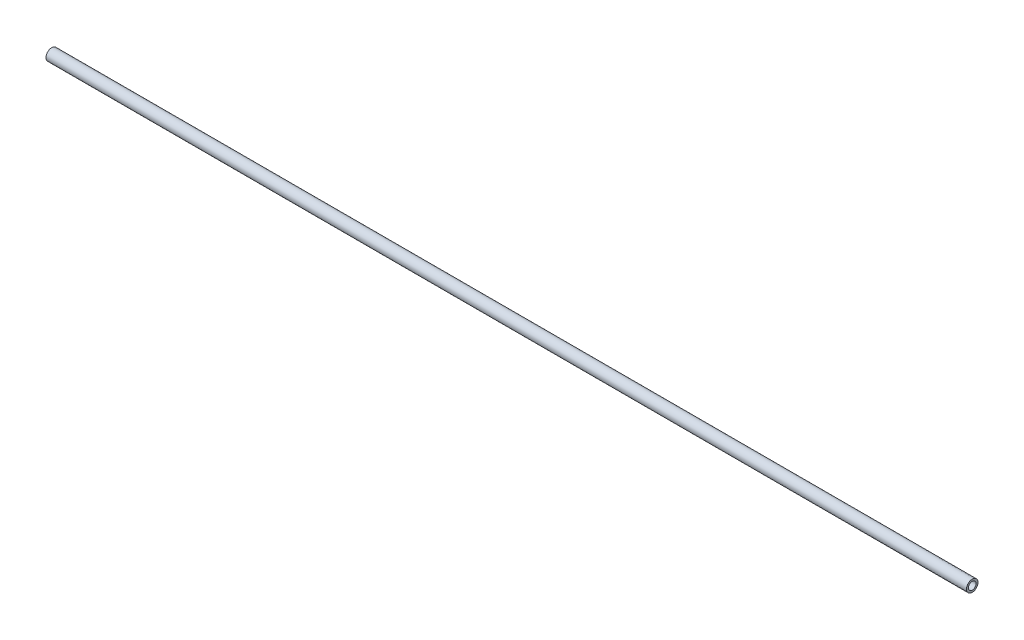
ISO-10303-21;
HEADER;
FILE_DESCRIPTION(('STEP AP214'),'2;1');
FILE_NAME('part.step','',(''),(''),'','','');
FILE_SCHEMA(('AUTOMOTIVE_DESIGN { 1 0 10303 214 1 1 1 1 }'));
ENDSEC;
DATA;
#1=APPLICATION_CONTEXT('core data for automotive mechanical design processes');
#2=APPLICATION_PROTOCOL_DEFINITION('international standard','automotive_design',2000,#1);
#3=PRODUCT_CONTEXT('',#1,'mechanical');
#4=PRODUCT('Part','Part','',(#3));
#5=PRODUCT_RELATED_PRODUCT_CATEGORY('part','',(#4));
#6=PRODUCT_DEFINITION_FORMATION('','',#4);
#7=PRODUCT_DEFINITION_CONTEXT('part definition',#1,'design');
#8=PRODUCT_DEFINITION('design','',#6,#7);
#9=PRODUCT_DEFINITION_SHAPE('','',#8);
#10=(LENGTH_UNIT() NAMED_UNIT(*) SI_UNIT(.MILLI.,.METRE.));
#11=(NAMED_UNIT(*) PLANE_ANGLE_UNIT() SI_UNIT($,.RADIAN.));
#12=(NAMED_UNIT(*) SI_UNIT($,.STERADIAN.) SOLID_ANGLE_UNIT());
#13=UNCERTAINTY_MEASURE_WITH_UNIT(LENGTH_MEASURE(1.E-05),#10,'distance_accuracy_value','');
#14=(GEOMETRIC_REPRESENTATION_CONTEXT(3) GLOBAL_UNCERTAINTY_ASSIGNED_CONTEXT((#13)) GLOBAL_UNIT_ASSIGNED_CONTEXT((#10,
#11,#12)) REPRESENTATION_CONTEXT('',''));
#15=CARTESIAN_POINT('',(0.,0.,0.));
#16=DIRECTION('',(0.,0.,1.));
#17=DIRECTION('',(1.,0.,0.));
#18=AXIS2_PLACEMENT_3D('',#15,#16,#17);
#19=CARTESIAN_POINT('',(762.,0.,0.));
#20=DIRECTION('',(1.,0.,0.));
#21=DIRECTION('',(0.,0.,-1.));
#22=AXIS2_PLACEMENT_3D('',#19,#20,#21);
#23=PLANE('',#22);
#24=CARTESIAN_POINT('',(762.,0.,0.));
#25=DIRECTION('',(1.,0.,0.));
#26=DIRECTION('',(0.,0.,-1.));
#27=AXIS2_PLACEMENT_3D('',#24,#25,#26);
#28=CIRCLE('',#27,9.525);
#29=CARTESIAN_POINT('',(762.,0.,-9.525));
#30=VERTEX_POINT('',#29);
#31=EDGE_CURVE('E10',#30,#30,#28,.T.);
#32=ORIENTED_EDGE('',*,*,#31,.T.);
#33=EDGE_LOOP('',(#32));
#34=FACE_BOUND('',#33,.T.);
#35=CARTESIAN_POINT('',(762.,0.,0.));
#36=DIRECTION('',(1.,0.,0.));
#37=DIRECTION('',(0.,0.,-1.));
#38=AXIS2_PLACEMENT_3D('',#35,#36,#37);
#39=CIRCLE('',#38,6.35);
#40=CARTESIAN_POINT('',(762.,0.,-6.35));
#41=VERTEX_POINT('',#40);
#42=EDGE_CURVE('E41',#41,#41,#39,.T.);
#43=ORIENTED_EDGE('',*,*,#42,.F.);
#44=EDGE_LOOP('',(#43));
#45=FACE_BOUND('',#44,.T.);
#46=ADVANCED_FACE('F30',(#34,#45),#23,.T.);
#47=CARTESIAN_POINT('',(-762.,0.,0.));
#48=DIRECTION('',(1.,0.,0.));
#49=DIRECTION('',(0.,0.,-1.));
#50=AXIS2_PLACEMENT_3D('',#47,#48,#49);
#51=PLANE('',#50);
#52=CARTESIAN_POINT('',(-762.,0.,0.));
#53=DIRECTION('',(1.,0.,0.));
#54=DIRECTION('',(0.,0.,-1.));
#55=AXIS2_PLACEMENT_3D('',#52,#53,#54);
#56=CIRCLE('',#55,9.525);
#57=CARTESIAN_POINT('',(-762.,0.,-9.525));
#58=VERTEX_POINT('',#57);
#59=EDGE_CURVE('E34',#58,#58,#56,.T.);
#60=ORIENTED_EDGE('',*,*,#59,.F.);
#61=EDGE_LOOP('',(#60));
#62=FACE_BOUND('',#61,.T.);
#63=CARTESIAN_POINT('',(-762.,0.,0.));
#64=DIRECTION('',(1.,0.,0.));
#65=DIRECTION('',(0.,0.,-1.));
#66=AXIS2_PLACEMENT_3D('',#63,#64,#65);
#67=CIRCLE('',#66,6.35);
#68=CARTESIAN_POINT('',(-762.,0.,-6.35));
#69=VERTEX_POINT('',#68);
#70=EDGE_CURVE('E43',#69,#69,#67,.T.);
#71=ORIENTED_EDGE('',*,*,#70,.T.);
#72=EDGE_LOOP('',(#71));
#73=FACE_BOUND('',#72,.T.);
#74=ADVANCED_FACE('F53',(#62,#73),#51,.F.);
#75=CARTESIAN_POINT('',(762.,0.,0.));
#76=DIRECTION('',(-1.,0.,0.));
#77=DIRECTION('',(0.,0.,1.));
#78=AXIS2_PLACEMENT_3D('',#75,#76,#77);
#79=CYLINDRICAL_SURFACE('',#78,9.525);
#80=ORIENTED_EDGE('',*,*,#31,.F.);
#81=EDGE_LOOP('',(#80));
#82=FACE_BOUND('',#81,.T.);
#83=ORIENTED_EDGE('',*,*,#59,.T.);
#84=EDGE_LOOP('',(#83));
#85=FACE_BOUND('',#84,.T.);
#86=ADVANCED_FACE('F32',(#82,#85),#79,.T.);
#87=CARTESIAN_POINT('',(762.,0.,0.));
#88=DIRECTION('',(-1.,0.,0.));
#89=DIRECTION('',(0.,0.,1.));
#90=AXIS2_PLACEMENT_3D('',#87,#88,#89);
#91=CYLINDRICAL_SURFACE('',#90,6.35);
#92=ORIENTED_EDGE('',*,*,#42,.T.);
#93=EDGE_LOOP('',(#92));
#94=FACE_BOUND('',#93,.T.);
#95=ORIENTED_EDGE('',*,*,#70,.F.);
#96=EDGE_LOOP('',(#95));
#97=FACE_BOUND('',#96,.T.);
#98=ADVANCED_FACE('F49',(#94,#97),#91,.F.);
#99=CLOSED_SHELL('',(#46,#74,#86,#98));
#100=MANIFOLD_SOLID_BREP('B2',#99);
#101=ADVANCED_BREP_SHAPE_REPRESENTATION('',(#18,#100),#14);
#102=SHAPE_DEFINITION_REPRESENTATION(#9,#101);
ENDSEC;
END-ISO-10303-21;
